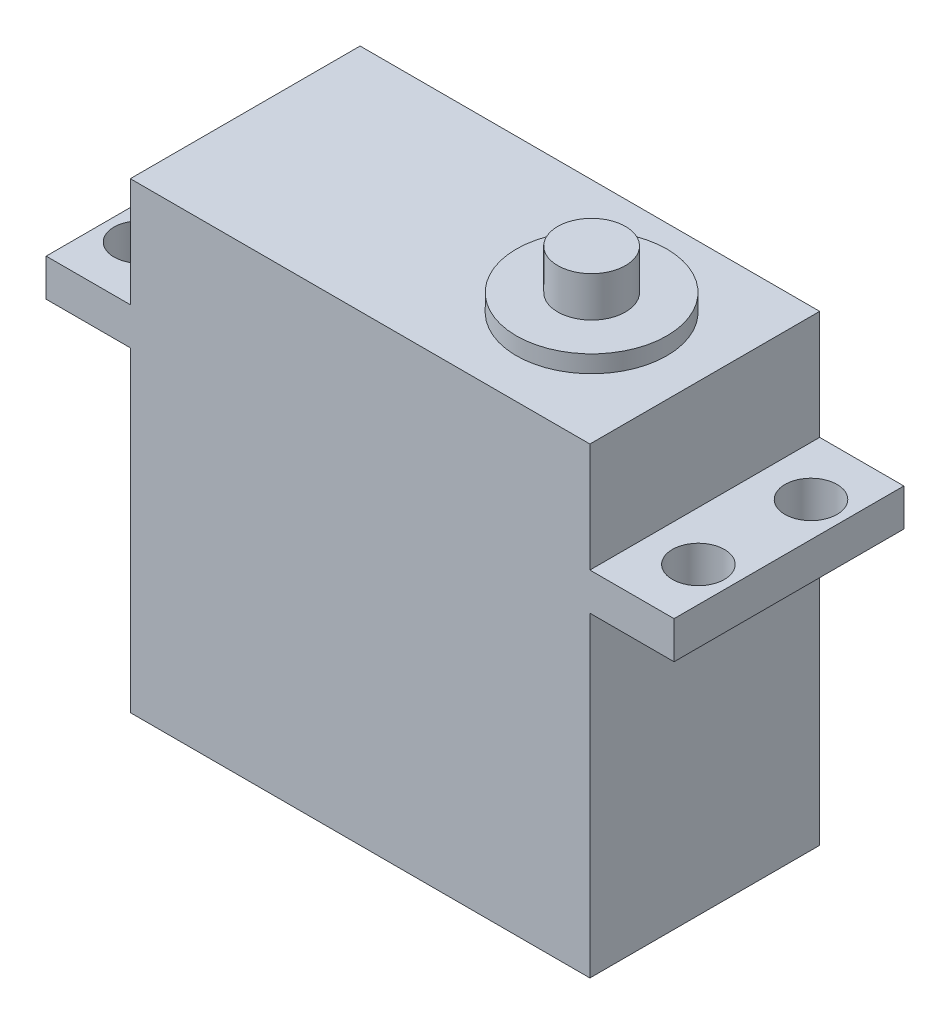
ISO-10303-21;
HEADER;
FILE_DESCRIPTION(('STEP AP214'),'2;1');
FILE_NAME('part.step','',(''),(''),'','','');
FILE_SCHEMA(('AUTOMOTIVE_DESIGN { 1 0 10303 214 1 1 1 1 }'));
ENDSEC;
DATA;
#1=APPLICATION_CONTEXT('core data for automotive mechanical design processes');
#2=APPLICATION_PROTOCOL_DEFINITION('international standard','automotive_design',2000,#1);
#3=PRODUCT_CONTEXT('',#1,'mechanical');
#4=PRODUCT('Part','Part','',(#3));
#5=PRODUCT_RELATED_PRODUCT_CATEGORY('part','',(#4));
#6=PRODUCT_DEFINITION_FORMATION('','',#4);
#7=PRODUCT_DEFINITION_CONTEXT('part definition',#1,'design');
#8=PRODUCT_DEFINITION('design','',#6,#7);
#9=PRODUCT_DEFINITION_SHAPE('','',#8);
#10=(LENGTH_UNIT() NAMED_UNIT(*) SI_UNIT(.MILLI.,.METRE.));
#11=(NAMED_UNIT(*) PLANE_ANGLE_UNIT() SI_UNIT($,.RADIAN.));
#12=(NAMED_UNIT(*) SI_UNIT($,.STERADIAN.) SOLID_ANGLE_UNIT());
#13=UNCERTAINTY_MEASURE_WITH_UNIT(LENGTH_MEASURE(1.E-05),#10,'distance_accuracy_value','');
#14=(GEOMETRIC_REPRESENTATION_CONTEXT(3) GLOBAL_UNCERTAINTY_ASSIGNED_CONTEXT((#13)) GLOBAL_UNIT_ASSIGNED_CONTEXT((#10,
#11,#12)) REPRESENTATION_CONTEXT('',''));
#15=CARTESIAN_POINT('',(0.,0.,0.));
#16=DIRECTION('',(0.,0.,1.));
#17=DIRECTION('',(1.,0.,0.));
#18=AXIS2_PLACEMENT_3D('',#15,#16,#17);
#19=CARTESIAN_POINT('',(0.,27.5,20.));
#20=DIRECTION('',(1.,0.,0.));
#21=DIRECTION('',(0.,0.,-1.));
#22=AXIS2_PLACEMENT_3D('',#19,#20,#21);
#23=PLANE('',#22);
#24=DIRECTION('',(0.,-1.,0.));
#25=VECTOR('',#24,1.);
#26=CARTESIAN_POINT('',(0.,27.5,0.));
#27=LINE('',#26,#25);
#28=CARTESIAN_POINT('',(0.,27.5,0.));
#29=VERTEX_POINT('',#28);
#30=CARTESIAN_POINT('',(0.,0.,0.));
#31=VERTEX_POINT('',#30);
#32=EDGE_CURVE('E160',#29,#31,#27,.T.);
#33=ORIENTED_EDGE('',*,*,#32,.T.);
#34=DIRECTION('',(0.,0.,-1.));
#35=VECTOR('',#34,1.);
#36=CARTESIAN_POINT('',(0.,0.,20.));
#37=LINE('',#36,#35);
#38=CARTESIAN_POINT('',(0.,0.,20.));
#39=VERTEX_POINT('',#38);
#40=EDGE_CURVE('E47',#39,#31,#37,.T.);
#41=ORIENTED_EDGE('',*,*,#40,.F.);
#42=DIRECTION('',(0.,-1.,0.));
#43=VECTOR('',#42,1.);
#44=CARTESIAN_POINT('',(0.,27.5,20.));
#45=LINE('',#44,#43);
#46=CARTESIAN_POINT('',(0.,27.5,20.));
#47=VERTEX_POINT('',#46);
#48=EDGE_CURVE('E183',#47,#39,#45,.T.);
#49=ORIENTED_EDGE('',*,*,#48,.F.);
#50=DIRECTION('',(0.,0.,-1.));
#51=VECTOR('',#50,1.);
#52=CARTESIAN_POINT('',(0.,27.5,20.));
#53=LINE('',#52,#51);
#54=EDGE_CURVE('E156',#47,#29,#53,.T.);
#55=ORIENTED_EDGE('',*,*,#54,.T.);
#56=EDGE_LOOP('',(#33,#41,#49,#55));
#57=FACE_BOUND('',#56,.T.);
#58=ADVANCED_FACE('F39',(#57),#23,.F.);
#59=CARTESIAN_POINT('',(0.,0.,20.));
#60=DIRECTION('',(0.,1.,0.));
#61=DIRECTION('',(0.,0.,1.));
#62=AXIS2_PLACEMENT_3D('',#59,#60,#61);
#63=PLANE('',#62);
#64=DIRECTION('',(1.,0.,0.));
#65=VECTOR('',#64,1.);
#66=CARTESIAN_POINT('',(0.,0.,0.));
#67=LINE('',#66,#65);
#68=CARTESIAN_POINT('',(40.,0.,0.));
#69=VERTEX_POINT('',#68);
#70=EDGE_CURVE('E163',#31,#69,#67,.T.);
#71=ORIENTED_EDGE('',*,*,#70,.T.);
#72=DIRECTION('',(0.,0.,-1.));
#73=VECTOR('',#72,1.);
#74=CARTESIAN_POINT('',(40.,0.,20.));
#75=LINE('',#74,#73);
#76=CARTESIAN_POINT('',(40.,0.,20.));
#77=VERTEX_POINT('',#76);
#78=EDGE_CURVE('E205',#77,#69,#75,.T.);
#79=ORIENTED_EDGE('',*,*,#78,.F.);
#80=DIRECTION('',(1.,0.,0.));
#81=VECTOR('',#80,1.);
#82=CARTESIAN_POINT('',(0.,0.,20.));
#83=LINE('',#82,#81);
#84=EDGE_CURVE('E111',#39,#77,#83,.T.);
#85=ORIENTED_EDGE('',*,*,#84,.F.);
#86=ORIENTED_EDGE('',*,*,#40,.T.);
#87=EDGE_LOOP('',(#71,#79,#85,#86));
#88=FACE_BOUND('',#87,.T.);
#89=ADVANCED_FACE('F288',(#88),#63,.F.);
#90=CARTESIAN_POINT('',(40.,0.,20.));
#91=DIRECTION('',(-1.,0.,0.));
#92=DIRECTION('',(0.,0.,1.));
#93=AXIS2_PLACEMENT_3D('',#90,#91,#92);
#94=PLANE('',#93);
#95=DIRECTION('',(0.,1.,0.));
#96=VECTOR('',#95,1.);
#97=CARTESIAN_POINT('',(40.,0.,0.));
#98=LINE('',#97,#96);
#99=CARTESIAN_POINT('',(40.,27.5,0.));
#100=VERTEX_POINT('',#99);
#101=EDGE_CURVE('E166',#69,#100,#98,.T.);
#102=ORIENTED_EDGE('',*,*,#101,.T.);
#103=DIRECTION('',(0.,0.,-1.));
#104=VECTOR('',#103,1.);
#105=CARTESIAN_POINT('',(40.,27.5,20.));
#106=LINE('',#105,#104);
#107=CARTESIAN_POINT('',(40.,27.5,20.));
#108=VERTEX_POINT('',#107);
#109=EDGE_CURVE('E202',#108,#100,#106,.T.);
#110=ORIENTED_EDGE('',*,*,#109,.F.);
#111=DIRECTION('',(0.,1.,0.));
#112=VECTOR('',#111,1.);
#113=CARTESIAN_POINT('',(40.,0.,20.));
#114=LINE('',#113,#112);
#115=EDGE_CURVE('E246',#77,#108,#114,.T.);
#116=ORIENTED_EDGE('',*,*,#115,.F.);
#117=ORIENTED_EDGE('',*,*,#78,.T.);
#118=EDGE_LOOP('',(#102,#110,#116,#117));
#119=FACE_BOUND('',#118,.T.);
#120=ADVANCED_FACE('F292',(#119),#94,.F.);
#121=CARTESIAN_POINT('',(40.,27.5,20.));
#122=DIRECTION('',(0.,1.,0.));
#123=DIRECTION('',(0.,0.,1.));
#124=AXIS2_PLACEMENT_3D('',#121,#122,#123);
#125=PLANE('',#124);
#126=CARTESIAN_POINT('',(44.3,27.5,5.05544469423316));
#127=DIRECTION('',(0.,1.,0.));
#128=DIRECTION('',(0.,0.,1.));
#129=AXIS2_PLACEMENT_3D('',#126,#127,#128);
#130=CIRCLE('',#129,2.26481762113897);
#131=CARTESIAN_POINT('',(44.3,27.5,7.32026231537213));
#132=VERTEX_POINT('',#131);
#133=EDGE_CURVE('E233',#132,#132,#130,.F.);
#134=ORIENTED_EDGE('',*,*,#133,.F.);
#135=EDGE_LOOP('',(#134));
#136=FACE_BOUND('',#135,.T.);
#137=CARTESIAN_POINT('',(44.3,27.5,14.8554446942332));
#138=DIRECTION('',(0.,1.,0.));
#139=DIRECTION('',(0.,0.,1.));
#140=AXIS2_PLACEMENT_3D('',#137,#138,#139);
#141=CIRCLE('',#140,2.26481762113897);
#142=CARTESIAN_POINT('',(44.3,27.5,17.1202623153721));
#143=VERTEX_POINT('',#142);
#144=EDGE_CURVE('E226',#143,#143,#141,.F.);
#145=ORIENTED_EDGE('',*,*,#144,.F.);
#146=EDGE_LOOP('',(#145));
#147=FACE_BOUND('',#146,.T.);
#148=DIRECTION('',(1.,0.,0.));
#149=VECTOR('',#148,1.);
#150=CARTESIAN_POINT('',(40.,27.5,0.));
#151=LINE('',#150,#149);
#152=CARTESIAN_POINT('',(47.325,27.5,0.));
#153=VERTEX_POINT('',#152);
#154=EDGE_CURVE('E168',#100,#153,#151,.T.);
#155=ORIENTED_EDGE('',*,*,#154,.T.);
#156=DIRECTION('',(0.,0.,-1.));
#157=VECTOR('',#156,1.);
#158=CARTESIAN_POINT('',(47.325,27.5,20.));
#159=LINE('',#158,#157);
#160=CARTESIAN_POINT('',(47.325,27.5,20.));
#161=VERTEX_POINT('',#160);
#162=EDGE_CURVE('E199',#161,#153,#159,.T.);
#163=ORIENTED_EDGE('',*,*,#162,.F.);
#164=DIRECTION('',(1.,0.,0.));
#165=VECTOR('',#164,1.);
#166=CARTESIAN_POINT('',(40.,27.5,20.));
#167=LINE('',#166,#165);
#168=EDGE_CURVE('E248',#108,#161,#167,.T.);
#169=ORIENTED_EDGE('',*,*,#168,.F.);
#170=ORIENTED_EDGE('',*,*,#109,.T.);
#171=EDGE_LOOP('',(#155,#163,#169,#170));
#172=FACE_BOUND('',#171,.T.);
#173=ADVANCED_FACE('F296',(#136,#147,#172),#125,.F.);
#174=CARTESIAN_POINT('',(47.325,27.5,20.));
#175=DIRECTION('',(-1.,0.,0.));
#176=DIRECTION('',(0.,0.,1.));
#177=AXIS2_PLACEMENT_3D('',#174,#175,#176);
#178=PLANE('',#177);
#179=DIRECTION('',(0.,1.,0.));
#180=VECTOR('',#179,1.);
#181=CARTESIAN_POINT('',(47.325,27.5,0.));
#182=LINE('',#181,#180);
#183=CARTESIAN_POINT('',(47.325,30.75,0.));
#184=VERTEX_POINT('',#183);
#185=EDGE_CURVE('E170',#153,#184,#182,.T.);
#186=ORIENTED_EDGE('',*,*,#185,.T.);
#187=DIRECTION('',(0.,0.,-1.));
#188=VECTOR('',#187,1.);
#189=CARTESIAN_POINT('',(47.325,30.75,20.));
#190=LINE('',#189,#188);
#191=CARTESIAN_POINT('',(47.325,30.75,20.));
#192=VERTEX_POINT('',#191);
#193=EDGE_CURVE('E196',#192,#184,#190,.T.);
#194=ORIENTED_EDGE('',*,*,#193,.F.);
#195=DIRECTION('',(0.,1.,0.));
#196=VECTOR('',#195,1.);
#197=CARTESIAN_POINT('',(47.325,27.5,20.));
#198=LINE('',#197,#196);
#199=EDGE_CURVE('E250',#161,#192,#198,.T.);
#200=ORIENTED_EDGE('',*,*,#199,.F.);
#201=ORIENTED_EDGE('',*,*,#162,.T.);
#202=EDGE_LOOP('',(#186,#194,#200,#201));
#203=FACE_BOUND('',#202,.T.);
#204=ADVANCED_FACE('F302',(#203),#178,.F.);
#205=CARTESIAN_POINT('',(47.325,30.75,20.));
#206=DIRECTION('',(0.,-1.,0.));
#207=DIRECTION('',(0.,0.,-1.));
#208=AXIS2_PLACEMENT_3D('',#205,#206,#207);
#209=PLANE('',#208);
#210=CARTESIAN_POINT('',(44.3,30.75,5.05544469423316));
#211=DIRECTION('',(0.,1.,0.));
#212=DIRECTION('',(0.,0.,1.));
#213=AXIS2_PLACEMENT_3D('',#210,#211,#212);
#214=CIRCLE('',#213,2.26481762113897);
#215=CARTESIAN_POINT('',(44.3,30.75,7.32026231537213));
#216=VERTEX_POINT('',#215);
#217=EDGE_CURVE('E215',#216,#216,#214,.T.);
#218=ORIENTED_EDGE('',*,*,#217,.F.);
#219=EDGE_LOOP('',(#218));
#220=FACE_BOUND('',#219,.T.);
#221=CARTESIAN_POINT('',(44.3,30.75,14.8554446942332));
#222=DIRECTION('',(0.,1.,0.));
#223=DIRECTION('',(0.,0.,1.));
#224=AXIS2_PLACEMENT_3D('',#221,#222,#223);
#225=CIRCLE('',#224,2.26481762113897);
#226=CARTESIAN_POINT('',(44.3,30.75,17.1202623153721));
#227=VERTEX_POINT('',#226);
#228=EDGE_CURVE('E230',#227,#227,#225,.T.);
#229=ORIENTED_EDGE('',*,*,#228,.F.);
#230=EDGE_LOOP('',(#229));
#231=FACE_BOUND('',#230,.T.);
#232=DIRECTION('',(-1.,0.,0.));
#233=VECTOR('',#232,1.);
#234=CARTESIAN_POINT('',(47.325,30.75,0.));
#235=LINE('',#234,#233);
#236=CARTESIAN_POINT('',(40.,30.75,0.));
#237=VERTEX_POINT('',#236);
#238=EDGE_CURVE('E172',#184,#237,#235,.T.);
#239=ORIENTED_EDGE('',*,*,#238,.T.);
#240=DIRECTION('',(0.,0.,-1.));
#241=VECTOR('',#240,1.);
#242=CARTESIAN_POINT('',(40.,30.75,20.));
#243=LINE('',#242,#241);
#244=CARTESIAN_POINT('',(40.,30.75,20.));
#245=VERTEX_POINT('',#244);
#246=EDGE_CURVE('E193',#245,#237,#243,.T.);
#247=ORIENTED_EDGE('',*,*,#246,.F.);
#248=DIRECTION('',(-1.,0.,0.));
#249=VECTOR('',#248,1.);
#250=CARTESIAN_POINT('',(47.325,30.75,20.));
#251=LINE('',#250,#249);
#252=EDGE_CURVE('E252',#192,#245,#251,.T.);
#253=ORIENTED_EDGE('',*,*,#252,.F.);
#254=ORIENTED_EDGE('',*,*,#193,.T.);
#255=EDGE_LOOP('',(#239,#247,#253,#254));
#256=FACE_BOUND('',#255,.T.);
#257=ADVANCED_FACE('F306',(#220,#231,#256),#209,.F.);
#258=CARTESIAN_POINT('',(40.,30.75,20.));
#259=DIRECTION('',(-1.,0.,0.));
#260=DIRECTION('',(0.,-1.,0.));
#261=AXIS2_PLACEMENT_3D('',#258,#259,#260);
#262=PLANE('',#261);
#263=DIRECTION('',(0.,1.,0.));
#264=VECTOR('',#263,1.);
#265=CARTESIAN_POINT('',(40.,30.75,0.));
#266=LINE('',#265,#264);
#267=CARTESIAN_POINT('',(40.,40.25,0.));
#268=VERTEX_POINT('',#267);
#269=EDGE_CURVE('E174',#237,#268,#266,.T.);
#270=ORIENTED_EDGE('',*,*,#269,.T.);
#271=DIRECTION('',(0.,0.,-1.));
#272=VECTOR('',#271,1.);
#273=CARTESIAN_POINT('',(40.,40.25,20.));
#274=LINE('',#273,#272);
#275=CARTESIAN_POINT('',(40.,40.25,20.));
#276=VERTEX_POINT('',#275);
#277=EDGE_CURVE('E190',#276,#268,#274,.T.);
#278=ORIENTED_EDGE('',*,*,#277,.F.);
#279=DIRECTION('',(0.,1.,0.));
#280=VECTOR('',#279,1.);
#281=CARTESIAN_POINT('',(40.,30.75,20.));
#282=LINE('',#281,#280);
#283=EDGE_CURVE('E254',#245,#276,#282,.T.);
#284=ORIENTED_EDGE('',*,*,#283,.F.);
#285=ORIENTED_EDGE('',*,*,#246,.T.);
#286=EDGE_LOOP('',(#270,#278,#284,#285));
#287=FACE_BOUND('',#286,.T.);
#288=ADVANCED_FACE('F310',(#287),#262,.F.);
#289=CARTESIAN_POINT('',(40.,40.25,20.));
#290=DIRECTION('',(0.,-1.,0.));
#291=DIRECTION('',(1.,0.,0.));
#292=AXIS2_PLACEMENT_3D('',#289,#290,#291);
#293=PLANE('',#292);
#294=CARTESIAN_POINT('',(30.15,40.25,10.));
#295=DIRECTION('',(0.,-1.,0.));
#296=DIRECTION('',(1.,0.,0.));
#297=AXIS2_PLACEMENT_3D('',#294,#295,#296);
#298=CIRCLE('',#297,6.55);
#299=CARTESIAN_POINT('',(36.7,40.25,10.));
#300=VERTEX_POINT('',#299);
#301=EDGE_CURVE('E11',#300,#300,#298,.F.);
#302=ORIENTED_EDGE('',*,*,#301,.F.);
#303=EDGE_LOOP('',(#302));
#304=FACE_BOUND('',#303,.T.);
#305=DIRECTION('',(-1.,0.,0.));
#306=VECTOR('',#305,1.);
#307=CARTESIAN_POINT('',(40.,40.25,0.));
#308=LINE('',#307,#306);
#309=CARTESIAN_POINT('',(0.,40.25,0.));
#310=VERTEX_POINT('',#309);
#311=EDGE_CURVE('E176',#268,#310,#308,.T.);
#312=ORIENTED_EDGE('',*,*,#311,.T.);
#313=DIRECTION('',(0.,0.,-1.));
#314=VECTOR('',#313,1.);
#315=CARTESIAN_POINT('',(0.,40.25,20.));
#316=LINE('',#315,#314);
#317=CARTESIAN_POINT('',(0.,40.25,20.));
#318=VERTEX_POINT('',#317);
#319=EDGE_CURVE('E187',#318,#310,#316,.T.);
#320=ORIENTED_EDGE('',*,*,#319,.F.);
#321=DIRECTION('',(-1.,0.,0.));
#322=VECTOR('',#321,1.);
#323=CARTESIAN_POINT('',(40.,40.25,20.));
#324=LINE('',#323,#322);
#325=EDGE_CURVE('E256',#276,#318,#324,.T.);
#326=ORIENTED_EDGE('',*,*,#325,.F.);
#327=ORIENTED_EDGE('',*,*,#277,.T.);
#328=EDGE_LOOP('',(#312,#320,#326,#327));
#329=FACE_BOUND('',#328,.T.);
#330=ADVANCED_FACE('F262',(#304,#329),#293,.F.);
#331=CARTESIAN_POINT('',(0.,40.25,20.));
#332=DIRECTION('',(1.,0.,0.));
#333=DIRECTION('',(0.,1.,0.));
#334=AXIS2_PLACEMENT_3D('',#331,#332,#333);
#335=PLANE('',#334);
#336=DIRECTION('',(0.,-1.,0.));
#337=VECTOR('',#336,1.);
#338=CARTESIAN_POINT('',(0.,40.25,0.));
#339=LINE('',#338,#337);
#340=CARTESIAN_POINT('',(0.,30.75,0.));
#341=VERTEX_POINT('',#340);
#342=EDGE_CURVE('E178',#310,#341,#339,.T.);
#343=ORIENTED_EDGE('',*,*,#342,.T.);
#344=DIRECTION('',(0.,0.,-1.));
#345=VECTOR('',#344,1.);
#346=CARTESIAN_POINT('',(0.,30.75,20.));
#347=LINE('',#346,#345);
#348=CARTESIAN_POINT('',(0.,30.75,20.));
#349=VERTEX_POINT('',#348);
#350=EDGE_CURVE('E151',#349,#341,#347,.T.);
#351=ORIENTED_EDGE('',*,*,#350,.F.);
#352=DIRECTION('',(0.,-1.,0.));
#353=VECTOR('',#352,1.);
#354=CARTESIAN_POINT('',(0.,40.25,20.));
#355=LINE('',#354,#353);
#356=EDGE_CURVE('E142',#318,#349,#355,.T.);
#357=ORIENTED_EDGE('',*,*,#356,.F.);
#358=ORIENTED_EDGE('',*,*,#319,.T.);
#359=EDGE_LOOP('',(#343,#351,#357,#358));
#360=FACE_BOUND('',#359,.T.);
#361=ADVANCED_FACE('F266',(#360),#335,.F.);
#362=CARTESIAN_POINT('',(0.,30.75,20.));
#363=DIRECTION('',(0.,-1.,0.));
#364=DIRECTION('',(0.,0.,-1.));
#365=AXIS2_PLACEMENT_3D('',#362,#363,#364);
#366=PLANE('',#365);
#367=CARTESIAN_POINT('',(-4.3,30.75,14.8554446942332));
#368=DIRECTION('',(0.,1.,0.));
#369=DIRECTION('',(0.,0.,1.));
#370=AXIS2_PLACEMENT_3D('',#367,#368,#369);
#371=CIRCLE('',#370,2.26481762113897);
#372=CARTESIAN_POINT('',(-4.3,30.75,17.1202623153721));
#373=VERTEX_POINT('',#372);
#374=EDGE_CURVE('E222',#373,#373,#371,.T.);
#375=ORIENTED_EDGE('',*,*,#374,.F.);
#376=EDGE_LOOP('',(#375));
#377=FACE_BOUND('',#376,.T.);
#378=CARTESIAN_POINT('',(-4.3,30.75,5.05544469423316));
#379=DIRECTION('',(0.,1.,0.));
#380=DIRECTION('',(0.,0.,1.));
#381=AXIS2_PLACEMENT_3D('',#378,#379,#380);
#382=CIRCLE('',#381,2.26481762113897);
#383=CARTESIAN_POINT('',(-4.3,30.75,7.32026231537213));
#384=VERTEX_POINT('',#383);
#385=EDGE_CURVE('E229',#384,#384,#382,.T.);
#386=ORIENTED_EDGE('',*,*,#385,.F.);
#387=EDGE_LOOP('',(#386));
#388=FACE_BOUND('',#387,.T.);
#389=DIRECTION('',(-1.,0.,0.));
#390=VECTOR('',#389,1.);
#391=CARTESIAN_POINT('',(0.,30.75,0.));
#392=LINE('',#391,#390);
#393=CARTESIAN_POINT('',(-7.325,30.75,0.));
#394=VERTEX_POINT('',#393);
#395=EDGE_CURVE('E150',#341,#394,#392,.T.);
#396=ORIENTED_EDGE('',*,*,#395,.T.);
#397=DIRECTION('',(0.,0.,-1.));
#398=VECTOR('',#397,1.);
#399=CARTESIAN_POINT('',(-7.325,30.75,20.));
#400=LINE('',#399,#398);
#401=CARTESIAN_POINT('',(-7.325,30.75,20.));
#402=VERTEX_POINT('',#401);
#403=EDGE_CURVE('E147',#402,#394,#400,.T.);
#404=ORIENTED_EDGE('',*,*,#403,.F.);
#405=DIRECTION('',(-1.,0.,0.));
#406=VECTOR('',#405,1.);
#407=CARTESIAN_POINT('',(0.,30.75,20.));
#408=LINE('',#407,#406);
#409=EDGE_CURVE('E136',#349,#402,#408,.T.);
#410=ORIENTED_EDGE('',*,*,#409,.F.);
#411=ORIENTED_EDGE('',*,*,#350,.T.);
#412=EDGE_LOOP('',(#396,#404,#410,#411));
#413=FACE_BOUND('',#412,.T.);
#414=ADVANCED_FACE('F148',(#377,#388,#413),#366,.F.);
#415=CARTESIAN_POINT('',(-7.325,30.75,20.));
#416=DIRECTION('',(1.,0.,0.));
#417=DIRECTION('',(0.,0.,-1.));
#418=AXIS2_PLACEMENT_3D('',#415,#416,#417);
#419=PLANE('',#418);
#420=DIRECTION('',(0.,-1.,0.));
#421=VECTOR('',#420,1.);
#422=CARTESIAN_POINT('',(-7.325,30.75,0.));
#423=LINE('',#422,#421);
#424=CARTESIAN_POINT('',(-7.325,27.5,0.));
#425=VERTEX_POINT('',#424);
#426=EDGE_CURVE('E96',#394,#425,#423,.T.);
#427=ORIENTED_EDGE('',*,*,#426,.T.);
#428=DIRECTION('',(0.,0.,-1.));
#429=VECTOR('',#428,1.);
#430=CARTESIAN_POINT('',(-7.325,27.5,20.));
#431=LINE('',#430,#429);
#432=CARTESIAN_POINT('',(-7.325,27.5,20.));
#433=VERTEX_POINT('',#432);
#434=EDGE_CURVE('E152',#433,#425,#431,.T.);
#435=ORIENTED_EDGE('',*,*,#434,.F.);
#436=DIRECTION('',(0.,-1.,0.));
#437=VECTOR('',#436,1.);
#438=CARTESIAN_POINT('',(-7.325,30.75,20.));
#439=LINE('',#438,#437);
#440=EDGE_CURVE('E140',#402,#433,#439,.T.);
#441=ORIENTED_EDGE('',*,*,#440,.F.);
#442=ORIENTED_EDGE('',*,*,#403,.T.);
#443=EDGE_LOOP('',(#427,#435,#441,#442));
#444=FACE_BOUND('',#443,.T.);
#445=ADVANCED_FACE('F154',(#444),#419,.F.);
#446=CARTESIAN_POINT('',(-7.325,27.5,20.));
#447=DIRECTION('',(0.,1.,0.));
#448=DIRECTION('',(0.,0.,1.));
#449=AXIS2_PLACEMENT_3D('',#446,#447,#448);
#450=PLANE('',#449);
#451=CARTESIAN_POINT('',(-4.3,27.5,14.8554446942332));
#452=DIRECTION('',(0.,1.,0.));
#453=DIRECTION('',(0.,0.,1.));
#454=AXIS2_PLACEMENT_3D('',#451,#452,#453);
#455=CIRCLE('',#454,2.26481762113897);
#456=CARTESIAN_POINT('',(-4.3,27.5,17.1202623153721));
#457=VERTEX_POINT('',#456);
#458=EDGE_CURVE('E225',#457,#457,#455,.F.);
#459=ORIENTED_EDGE('',*,*,#458,.F.);
#460=EDGE_LOOP('',(#459));
#461=FACE_BOUND('',#460,.T.);
#462=CARTESIAN_POINT('',(-4.3,27.5,5.05544469423316));
#463=DIRECTION('',(0.,1.,0.));
#464=DIRECTION('',(0.,0.,1.));
#465=AXIS2_PLACEMENT_3D('',#462,#463,#464);
#466=CIRCLE('',#465,2.26481762113897);
#467=CARTESIAN_POINT('',(-4.3,27.5,7.32026231537213));
#468=VERTEX_POINT('',#467);
#469=EDGE_CURVE('E164',#468,#468,#466,.F.);
#470=ORIENTED_EDGE('',*,*,#469,.F.);
#471=EDGE_LOOP('',(#470));
#472=FACE_BOUND('',#471,.T.);
#473=DIRECTION('',(1.,0.,0.));
#474=VECTOR('',#473,1.);
#475=CARTESIAN_POINT('',(-7.325,27.5,0.));
#476=LINE('',#475,#474);
#477=EDGE_CURVE('E102',#425,#29,#476,.T.);
#478=ORIENTED_EDGE('',*,*,#477,.T.);
#479=ORIENTED_EDGE('',*,*,#54,.F.);
#480=DIRECTION('',(1.,0.,0.));
#481=VECTOR('',#480,1.);
#482=CARTESIAN_POINT('',(-7.325,27.5,20.));
#483=LINE('',#482,#481);
#484=EDGE_CURVE('E55',#433,#47,#483,.T.);
#485=ORIENTED_EDGE('',*,*,#484,.F.);
#486=ORIENTED_EDGE('',*,*,#434,.T.);
#487=EDGE_LOOP('',(#478,#479,#485,#486));
#488=FACE_BOUND('',#487,.T.);
#489=ADVANCED_FACE('F274',(#461,#472,#488),#450,.F.);
#490=CARTESIAN_POINT('',(0.,0.,20.));
#491=DIRECTION('',(0.,0.,1.));
#492=DIRECTION('',(1.,0.,0.));
#493=AXIS2_PLACEMENT_3D('',#490,#491,#492);
#494=PLANE('',#493);
#495=ORIENTED_EDGE('',*,*,#48,.T.);
#496=ORIENTED_EDGE('',*,*,#84,.T.);
#497=ORIENTED_EDGE('',*,*,#115,.T.);
#498=ORIENTED_EDGE('',*,*,#168,.T.);
#499=ORIENTED_EDGE('',*,*,#199,.T.);
#500=ORIENTED_EDGE('',*,*,#252,.T.);
#501=ORIENTED_EDGE('',*,*,#283,.T.);
#502=ORIENTED_EDGE('',*,*,#325,.T.);
#503=ORIENTED_EDGE('',*,*,#356,.T.);
#504=ORIENTED_EDGE('',*,*,#409,.T.);
#505=ORIENTED_EDGE('',*,*,#440,.T.);
#506=ORIENTED_EDGE('',*,*,#484,.T.);
#507=EDGE_LOOP('',(#495,#496,#497,#498,#499,#500,#501,#502,#503,#504,#505,#506));
#508=FACE_BOUND('',#507,.T.);
#509=ADVANCED_FACE('F138',(#508),#494,.T.);
#510=CARTESIAN_POINT('',(0.,0.,0.));
#511=DIRECTION('',(0.,0.,1.));
#512=DIRECTION('',(1.,0.,0.));
#513=AXIS2_PLACEMENT_3D('',#510,#511,#512);
#514=PLANE('',#513);
#515=ORIENTED_EDGE('',*,*,#32,.F.);
#516=ORIENTED_EDGE('',*,*,#477,.F.);
#517=ORIENTED_EDGE('',*,*,#426,.F.);
#518=ORIENTED_EDGE('',*,*,#395,.F.);
#519=ORIENTED_EDGE('',*,*,#342,.F.);
#520=ORIENTED_EDGE('',*,*,#311,.F.);
#521=ORIENTED_EDGE('',*,*,#269,.F.);
#522=ORIENTED_EDGE('',*,*,#238,.F.);
#523=ORIENTED_EDGE('',*,*,#185,.F.);
#524=ORIENTED_EDGE('',*,*,#154,.F.);
#525=ORIENTED_EDGE('',*,*,#101,.F.);
#526=ORIENTED_EDGE('',*,*,#70,.F.);
#527=EDGE_LOOP('',(#515,#516,#517,#518,#519,#520,#521,#522,#523,#524,#525,#526));
#528=FACE_BOUND('',#527,.T.);
#529=ADVANCED_FACE('F269',(#528),#514,.F.);
#530=CARTESIAN_POINT('',(-4.3,21.0941284077674,5.05544469423316));
#531=DIRECTION('',(0.,1.,0.));
#532=DIRECTION('',(0.,0.,1.));
#533=AXIS2_PLACEMENT_3D('',#530,#531,#532);
#534=CYLINDRICAL_SURFACE('',#533,2.26481762113897);
#535=ORIENTED_EDGE('',*,*,#469,.T.);
#536=EDGE_LOOP('',(#535));
#537=FACE_BOUND('',#536,.T.);
#538=ORIENTED_EDGE('',*,*,#385,.T.);
#539=EDGE_LOOP('',(#538));
#540=FACE_BOUND('',#539,.T.);
#541=ADVANCED_FACE('F328',(#537,#540),#534,.F.);
#542=CARTESIAN_POINT('',(-4.3,21.0941284077674,14.8554446942332));
#543=DIRECTION('',(0.,1.,0.));
#544=DIRECTION('',(0.,0.,1.));
#545=AXIS2_PLACEMENT_3D('',#542,#543,#544);
#546=CYLINDRICAL_SURFACE('',#545,2.26481762113897);
#547=ORIENTED_EDGE('',*,*,#458,.T.);
#548=EDGE_LOOP('',(#547));
#549=FACE_BOUND('',#548,.T.);
#550=ORIENTED_EDGE('',*,*,#374,.T.);
#551=EDGE_LOOP('',(#550));
#552=FACE_BOUND('',#551,.T.);
#553=ADVANCED_FACE('F330',(#549,#552),#546,.F.);
#554=CARTESIAN_POINT('',(44.3,21.0941284077674,14.8554446942332));
#555=DIRECTION('',(0.,1.,0.));
#556=DIRECTION('',(0.,0.,1.));
#557=AXIS2_PLACEMENT_3D('',#554,#555,#556);
#558=CYLINDRICAL_SURFACE('',#557,2.26481762113897);
#559=ORIENTED_EDGE('',*,*,#144,.T.);
#560=EDGE_LOOP('',(#559));
#561=FACE_BOUND('',#560,.T.);
#562=ORIENTED_EDGE('',*,*,#228,.T.);
#563=EDGE_LOOP('',(#562));
#564=FACE_BOUND('',#563,.T.);
#565=ADVANCED_FACE('F337',(#561,#564),#558,.F.);
#566=CARTESIAN_POINT('',(44.3,21.0941284077674,5.05544469423316));
#567=DIRECTION('',(0.,1.,0.));
#568=DIRECTION('',(0.,0.,1.));
#569=AXIS2_PLACEMENT_3D('',#566,#567,#568);
#570=CYLINDRICAL_SURFACE('',#569,2.26481762113897);
#571=ORIENTED_EDGE('',*,*,#133,.T.);
#572=EDGE_LOOP('',(#571));
#573=FACE_BOUND('',#572,.T.);
#574=ORIENTED_EDGE('',*,*,#217,.T.);
#575=EDGE_LOOP('',(#574));
#576=FACE_BOUND('',#575,.T.);
#577=ADVANCED_FACE('F341',(#573,#576),#570,.F.);
#578=CARTESIAN_POINT('',(30.15,41.75,10.));
#579=DIRECTION('',(0.,-1.,0.));
#580=DIRECTION('',(1.,0.,0.));
#581=AXIS2_PLACEMENT_3D('',#578,#579,#580);
#582=CYLINDRICAL_SURFACE('',#581,6.55);
#583=CARTESIAN_POINT('',(30.15,41.75,10.));
#584=DIRECTION('',(0.,1.,0.));
#585=DIRECTION('',(-1.,0.,0.));
#586=AXIS2_PLACEMENT_3D('',#583,#584,#585);
#587=CIRCLE('',#586,6.55);
#588=CARTESIAN_POINT('',(23.6,41.75,10.));
#589=VERTEX_POINT('',#588);
#590=EDGE_CURVE('E211',#589,#589,#587,.T.);
#591=ORIENTED_EDGE('',*,*,#590,.F.);
#592=EDGE_LOOP('',(#591));
#593=FACE_BOUND('',#592,.T.);
#594=ORIENTED_EDGE('',*,*,#301,.T.);
#595=EDGE_LOOP('',(#594));
#596=FACE_BOUND('',#595,.T.);
#597=ADVANCED_FACE('F344',(#593,#596),#582,.T.);
#598=CARTESIAN_POINT('',(30.15,41.75,10.));
#599=DIRECTION('',(0.,1.,0.));
#600=DIRECTION('',(-1.,0.,0.));
#601=AXIS2_PLACEMENT_3D('',#598,#599,#600);
#602=PLANE('',#601);
#603=CARTESIAN_POINT('',(30.15,41.75,10.));
#604=DIRECTION('',(0.,1.,0.));
#605=DIRECTION('',(-1.,0.,0.));
#606=AXIS2_PLACEMENT_3D('',#603,#604,#605);
#607=CIRCLE('',#606,2.95);
#608=CARTESIAN_POINT('',(27.2,41.75,10.));
#609=VERTEX_POINT('',#608);
#610=EDGE_CURVE('E208',#609,#609,#607,.T.);
#611=ORIENTED_EDGE('',*,*,#610,.F.);
#612=EDGE_LOOP('',(#611));
#613=FACE_BOUND('',#612,.T.);
#614=ORIENTED_EDGE('',*,*,#590,.T.);
#615=EDGE_LOOP('',(#614));
#616=FACE_BOUND('',#615,.T.);
#617=ADVANCED_FACE('F355',(#613,#616),#602,.T.);
#618=CARTESIAN_POINT('',(0.,45.25,0.));
#619=DIRECTION('',(0.,1.,0.));
#620=DIRECTION('',(-1.,0.,0.));
#621=AXIS2_PLACEMENT_3D('',#618,#619,#620);
#622=PLANE('',#621);
#623=CARTESIAN_POINT('',(30.15,45.25,10.));
#624=DIRECTION('',(0.,1.,0.));
#625=DIRECTION('',(-1.,0.,0.));
#626=AXIS2_PLACEMENT_3D('',#623,#624,#625);
#627=CIRCLE('',#626,2.95);
#628=CARTESIAN_POINT('',(27.2,45.25,10.));
#629=VERTEX_POINT('',#628);
#630=EDGE_CURVE('E210',#629,#629,#627,.T.);
#631=ORIENTED_EDGE('',*,*,#630,.T.);
#632=EDGE_LOOP('',(#631));
#633=FACE_BOUND('',#632,.T.);
#634=ADVANCED_FACE('F352',(#633),#622,.T.);
#635=CARTESIAN_POINT('',(30.15,45.25,10.));
#636=DIRECTION('',(0.,-1.,0.));
#637=DIRECTION('',(1.,0.,0.));
#638=AXIS2_PLACEMENT_3D('',#635,#636,#637);
#639=CYLINDRICAL_SURFACE('',#638,2.95);
#640=ORIENTED_EDGE('',*,*,#610,.T.);
#641=EDGE_LOOP('',(#640));
#642=FACE_BOUND('',#641,.T.);
#643=ORIENTED_EDGE('',*,*,#630,.F.);
#644=EDGE_LOOP('',(#643));
#645=FACE_BOUND('',#644,.T.);
#646=ADVANCED_FACE('F349',(#642,#645),#639,.T.);
#647=CLOSED_SHELL('',(#58,#89,#120,#173,#204,#257,#288,#330,#361,#414,#445,#489,#509,#529,#541,
#553,#565,#577,#597,#617,#634,#646));
#648=MANIFOLD_SOLID_BREP('B2',#647);
#649=ADVANCED_BREP_SHAPE_REPRESENTATION('',(#18,#648),#14);
#650=SHAPE_DEFINITION_REPRESENTATION(#9,#649);
ENDSEC;
END-ISO-10303-21;
